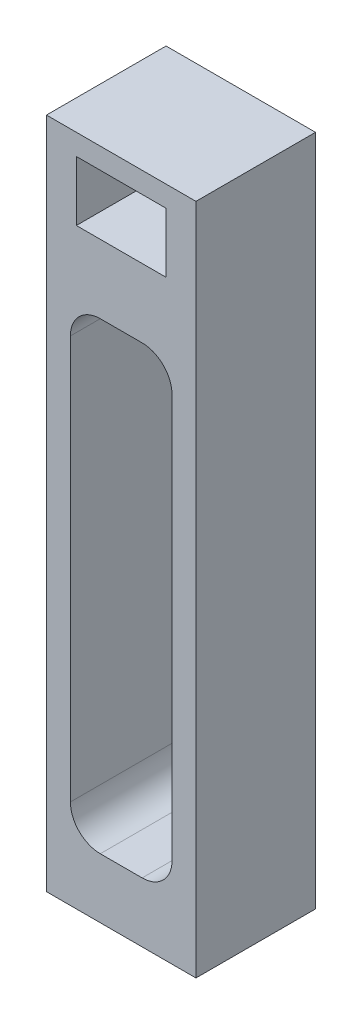
ISO-10303-21;
HEADER;
FILE_DESCRIPTION(('STEP AP214'),'2;1');
FILE_NAME('part.step','',(''),(''),'','','');
FILE_SCHEMA(('AUTOMOTIVE_DESIGN { 1 0 10303 214 1 1 1 1 }'));
ENDSEC;
DATA;
#1=APPLICATION_CONTEXT('core data for automotive mechanical design processes');
#2=APPLICATION_PROTOCOL_DEFINITION('international standard','automotive_design',2000,#1);
#3=PRODUCT_CONTEXT('',#1,'mechanical');
#4=PRODUCT('Part','Part','',(#3));
#5=PRODUCT_RELATED_PRODUCT_CATEGORY('part','',(#4));
#6=PRODUCT_DEFINITION_FORMATION('','',#4);
#7=PRODUCT_DEFINITION_CONTEXT('part definition',#1,'design');
#8=PRODUCT_DEFINITION('design','',#6,#7);
#9=PRODUCT_DEFINITION_SHAPE('','',#8);
#10=(LENGTH_UNIT() NAMED_UNIT(*) SI_UNIT(.MILLI.,.METRE.));
#11=(NAMED_UNIT(*) PLANE_ANGLE_UNIT() SI_UNIT($,.RADIAN.));
#12=(NAMED_UNIT(*) SI_UNIT($,.STERADIAN.) SOLID_ANGLE_UNIT());
#13=UNCERTAINTY_MEASURE_WITH_UNIT(LENGTH_MEASURE(1.E-05),#10,'distance_accuracy_value','');
#14=(GEOMETRIC_REPRESENTATION_CONTEXT(3) GLOBAL_UNCERTAINTY_ASSIGNED_CONTEXT((#13)) GLOBAL_UNIT_ASSIGNED_CONTEXT((#10,
#11,#12)) REPRESENTATION_CONTEXT('',''));
#15=CARTESIAN_POINT('',(0.,0.,0.));
#16=DIRECTION('',(0.,0.,1.));
#17=DIRECTION('',(1.,0.,0.));
#18=AXIS2_PLACEMENT_3D('',#15,#16,#17);
#19=CARTESIAN_POINT('',(12.5,-12.5,10.));
#20=DIRECTION('',(1.,0.,0.));
#21=DIRECTION('',(0.,0.,-1.));
#22=AXIS2_PLACEMENT_3D('',#19,#20,#21);
#23=PLANE('',#22);
#24=DIRECTION('',(0.,1.,0.));
#25=VECTOR('',#24,1.);
#26=CARTESIAN_POINT('',(12.5,-12.5,-10.));
#27=LINE('',#26,#25);
#28=CARTESIAN_POINT('',(12.5,-12.5,-10.));
#29=VERTEX_POINT('',#28);
#30=CARTESIAN_POINT('',(12.5,100.,-10.));
#31=VERTEX_POINT('',#30);
#32=EDGE_CURVE('E36',#29,#31,#27,.T.);
#33=ORIENTED_EDGE('',*,*,#32,.T.);
#34=DIRECTION('',(0.,0.,-1.));
#35=VECTOR('',#34,1.);
#36=CARTESIAN_POINT('',(12.5,100.,10.));
#37=LINE('',#36,#35);
#38=CARTESIAN_POINT('',(12.5,100.,10.));
#39=VERTEX_POINT('',#38);
#40=EDGE_CURVE('E240',#39,#31,#37,.T.);
#41=ORIENTED_EDGE('',*,*,#40,.F.);
#42=DIRECTION('',(0.,1.,0.));
#43=VECTOR('',#42,1.);
#44=CARTESIAN_POINT('',(12.5,-12.5,10.));
#45=LINE('',#44,#43);
#46=CARTESIAN_POINT('',(12.5,-12.5,10.));
#47=VERTEX_POINT('',#46);
#48=EDGE_CURVE('E11',#47,#39,#45,.T.);
#49=ORIENTED_EDGE('',*,*,#48,.F.);
#50=DIRECTION('',(0.,0.,-1.));
#51=VECTOR('',#50,1.);
#52=CARTESIAN_POINT('',(12.5,-12.5,10.));
#53=LINE('',#52,#51);
#54=EDGE_CURVE('E258',#47,#29,#53,.T.);
#55=ORIENTED_EDGE('',*,*,#54,.T.);
#56=EDGE_LOOP('',(#33,#41,#49,#55));
#57=FACE_BOUND('',#56,.T.);
#58=ADVANCED_FACE('F33',(#57),#23,.T.);
#59=CARTESIAN_POINT('',(-12.5,-12.5,10.));
#60=DIRECTION('',(0.,0.,1.));
#61=DIRECTION('',(1.,0.,0.));
#62=AXIS2_PLACEMENT_3D('',#59,#60,#61);
#63=PLANE('',#62);
#64=CARTESIAN_POINT('',(-3.5,2.5,10.));
#65=DIRECTION('',(0.,0.,1.));
#66=DIRECTION('',(1.,0.,0.));
#67=AXIS2_PLACEMENT_3D('',#64,#65,#66);
#68=CIRCLE('',#67,5.);
#69=CARTESIAN_POINT('',(-8.5,2.50000000000004,10.));
#70=VERTEX_POINT('',#69);
#71=CARTESIAN_POINT('',(-3.49999999999996,-2.5,10.));
#72=VERTEX_POINT('',#71);
#73=EDGE_CURVE('E49',#70,#72,#68,.T.);
#74=ORIENTED_EDGE('',*,*,#73,.F.);
#75=DIRECTION('',(0.,-1.,0.));
#76=VECTOR('',#75,1.);
#77=CARTESIAN_POINT('',(-8.5,2.50000000000004,10.));
#78=LINE('',#77,#76);
#79=CARTESIAN_POINT('',(-8.5,70.,10.));
#80=VERTEX_POINT('',#79);
#81=EDGE_CURVE('E165',#80,#70,#78,.T.);
#82=ORIENTED_EDGE('',*,*,#81,.F.);
#83=CARTESIAN_POINT('',(-3.5,70.,10.));
#84=DIRECTION('',(0.,0.,1.));
#85=DIRECTION('',(1.,0.,0.));
#86=AXIS2_PLACEMENT_3D('',#83,#84,#85);
#87=CIRCLE('',#86,5.);
#88=CARTESIAN_POINT('',(-3.49999999999996,75.,10.));
#89=VERTEX_POINT('',#88);
#90=EDGE_CURVE('E168',#89,#80,#87,.T.);
#91=ORIENTED_EDGE('',*,*,#90,.F.);
#92=DIRECTION('',(-1.,0.,0.));
#93=VECTOR('',#92,1.);
#94=CARTESIAN_POINT('',(-3.49999999999996,75.,10.));
#95=LINE('',#94,#93);
#96=CARTESIAN_POINT('',(3.49999999999997,75.,10.));
#97=VERTEX_POINT('',#96);
#98=EDGE_CURVE('E196',#97,#89,#95,.T.);
#99=ORIENTED_EDGE('',*,*,#98,.F.);
#100=CARTESIAN_POINT('',(3.5,70.,10.));
#101=DIRECTION('',(0.,0.,1.));
#102=DIRECTION('',(1.,0.,0.));
#103=AXIS2_PLACEMENT_3D('',#100,#101,#102);
#104=CIRCLE('',#103,5.);
#105=CARTESIAN_POINT('',(8.50000000000001,70.,10.));
#106=VERTEX_POINT('',#105);
#107=EDGE_CURVE('E193',#106,#97,#104,.T.);
#108=ORIENTED_EDGE('',*,*,#107,.F.);
#109=DIRECTION('',(0.,1.,0.));
#110=VECTOR('',#109,1.);
#111=CARTESIAN_POINT('',(8.5,2.50000000000004,10.));
#112=LINE('',#111,#110);
#113=CARTESIAN_POINT('',(8.5,2.50000000000004,10.));
#114=VERTEX_POINT('',#113);
#115=EDGE_CURVE('E190',#114,#106,#112,.T.);
#116=ORIENTED_EDGE('',*,*,#115,.F.);
#117=CARTESIAN_POINT('',(3.5,2.5,10.));
#118=DIRECTION('',(0.,0.,1.));
#119=DIRECTION('',(1.,0.,0.));
#120=AXIS2_PLACEMENT_3D('',#117,#118,#119);
#121=CIRCLE('',#120,5.);
#122=CARTESIAN_POINT('',(3.49999999999997,-2.5,10.));
#123=VERTEX_POINT('',#122);
#124=EDGE_CURVE('E187',#123,#114,#121,.T.);
#125=ORIENTED_EDGE('',*,*,#124,.F.);
#126=DIRECTION('',(1.,0.,0.));
#127=VECTOR('',#126,1.);
#128=CARTESIAN_POINT('',(-3.49999999999996,-2.5,10.));
#129=LINE('',#128,#127);
#130=EDGE_CURVE('E185',#72,#123,#129,.T.);
#131=ORIENTED_EDGE('',*,*,#130,.F.);
#132=EDGE_LOOP('',(#74,#82,#91,#99,#108,#116,#125,#131));
#133=FACE_BOUND('',#132,.T.);
#134=DIRECTION('',(0.,1.,0.));
#135=VECTOR('',#134,1.);
#136=CARTESIAN_POINT('',(7.5,86.5,10.));
#137=LINE('',#136,#135);
#138=CARTESIAN_POINT('',(7.5,86.5,10.));
#139=VERTEX_POINT('',#138);
#140=CARTESIAN_POINT('',(7.5,96.5,10.));
#141=VERTEX_POINT('',#140);
#142=EDGE_CURVE('E203',#139,#141,#137,.T.);
#143=ORIENTED_EDGE('',*,*,#142,.F.);
#144=DIRECTION('',(1.,0.,0.));
#145=VECTOR('',#144,1.);
#146=CARTESIAN_POINT('',(-7.5,86.5,10.));
#147=LINE('',#146,#145);
#148=CARTESIAN_POINT('',(-7.5,86.5,10.));
#149=VERTEX_POINT('',#148);
#150=EDGE_CURVE('E219',#149,#139,#147,.T.);
#151=ORIENTED_EDGE('',*,*,#150,.F.);
#152=DIRECTION('',(0.,-1.,0.));
#153=VECTOR('',#152,1.);
#154=CARTESIAN_POINT('',(-7.5,86.5,10.));
#155=LINE('',#154,#153);
#156=CARTESIAN_POINT('',(-7.5,96.5,10.));
#157=VERTEX_POINT('',#156);
#158=EDGE_CURVE('E233',#157,#149,#155,.T.);
#159=ORIENTED_EDGE('',*,*,#158,.F.);
#160=DIRECTION('',(-1.,0.,0.));
#161=VECTOR('',#160,1.);
#162=CARTESIAN_POINT('',(-7.5,96.5,10.));
#163=LINE('',#162,#161);
#164=EDGE_CURVE('E230',#141,#157,#163,.T.);
#165=ORIENTED_EDGE('',*,*,#164,.F.);
#166=EDGE_LOOP('',(#143,#151,#159,#165));
#167=FACE_BOUND('',#166,.T.);
#168=ORIENTED_EDGE('',*,*,#48,.T.);
#169=DIRECTION('',(1.,0.,0.));
#170=VECTOR('',#169,1.);
#171=CARTESIAN_POINT('',(-12.5,100.,10.));
#172=LINE('',#171,#170);
#173=CARTESIAN_POINT('',(-12.5,100.,10.));
#174=VERTEX_POINT('',#173);
#175=EDGE_CURVE('E255',#174,#39,#172,.T.);
#176=ORIENTED_EDGE('',*,*,#175,.F.);
#177=DIRECTION('',(0.,1.,0.));
#178=VECTOR('',#177,1.);
#179=CARTESIAN_POINT('',(-12.5,-12.5,10.));
#180=LINE('',#179,#178);
#181=CARTESIAN_POINT('',(-12.5,-12.5,10.));
#182=VERTEX_POINT('',#181);
#183=EDGE_CURVE('E41',#182,#174,#180,.T.);
#184=ORIENTED_EDGE('',*,*,#183,.F.);
#185=DIRECTION('',(1.,0.,0.));
#186=VECTOR('',#185,1.);
#187=CARTESIAN_POINT('',(-12.5,-12.5,10.));
#188=LINE('',#187,#186);
#189=EDGE_CURVE('E267',#182,#47,#188,.T.);
#190=ORIENTED_EDGE('',*,*,#189,.T.);
#191=EDGE_LOOP('',(#168,#176,#184,#190));
#192=FACE_BOUND('',#191,.T.);
#193=ADVANCED_FACE('F282',(#133,#167,#192),#63,.T.);
#194=CARTESIAN_POINT('',(-12.5,-12.5,10.));
#195=DIRECTION('',(-1.,0.,0.));
#196=DIRECTION('',(0.,0.,1.));
#197=AXIS2_PLACEMENT_3D('',#194,#195,#196);
#198=PLANE('',#197);
#199=ORIENTED_EDGE('',*,*,#183,.T.);
#200=DIRECTION('',(0.,0.,1.));
#201=VECTOR('',#200,1.);
#202=CARTESIAN_POINT('',(-12.5,100.,10.));
#203=LINE('',#202,#201);
#204=CARTESIAN_POINT('',(-12.5,100.,-10.));
#205=VERTEX_POINT('',#204);
#206=EDGE_CURVE('E252',#205,#174,#203,.T.);
#207=ORIENTED_EDGE('',*,*,#206,.F.);
#208=DIRECTION('',(0.,1.,0.));
#209=VECTOR('',#208,1.);
#210=CARTESIAN_POINT('',(-12.5,-12.5,-10.));
#211=LINE('',#210,#209);
#212=CARTESIAN_POINT('',(-12.5,-12.5,-10.));
#213=VERTEX_POINT('',#212);
#214=EDGE_CURVE('E270',#213,#205,#211,.T.);
#215=ORIENTED_EDGE('',*,*,#214,.F.);
#216=DIRECTION('',(0.,0.,1.));
#217=VECTOR('',#216,1.);
#218=CARTESIAN_POINT('',(-12.5,-12.5,10.));
#219=LINE('',#218,#217);
#220=EDGE_CURVE('E264',#213,#182,#219,.T.);
#221=ORIENTED_EDGE('',*,*,#220,.T.);
#222=EDGE_LOOP('',(#199,#207,#215,#221));
#223=FACE_BOUND('',#222,.T.);
#224=ADVANCED_FACE('F288',(#223),#198,.T.);
#225=CARTESIAN_POINT('',(-12.5,-12.5,-10.));
#226=DIRECTION('',(0.,0.,-1.));
#227=DIRECTION('',(-1.,0.,0.));
#228=AXIS2_PLACEMENT_3D('',#225,#226,#227);
#229=PLANE('',#228);
#230=CARTESIAN_POINT('',(-3.5,2.5,-10.));
#231=DIRECTION('',(0.,0.,1.));
#232=DIRECTION('',(1.,0.,0.));
#233=AXIS2_PLACEMENT_3D('',#230,#231,#232);
#234=CIRCLE('',#233,5.);
#235=CARTESIAN_POINT('',(-8.5,2.50000000000004,-10.));
#236=VERTEX_POINT('',#235);
#237=CARTESIAN_POINT('',(-3.49999999999996,-2.5,-10.));
#238=VERTEX_POINT('',#237);
#239=EDGE_CURVE('E148',#236,#238,#234,.T.);
#240=ORIENTED_EDGE('',*,*,#239,.T.);
#241=DIRECTION('',(1.,0.,0.));
#242=VECTOR('',#241,1.);
#243=CARTESIAN_POINT('',(-3.49999999999996,-2.5,-10.));
#244=LINE('',#243,#242);
#245=CARTESIAN_POINT('',(3.49999999999996,-2.5,-10.));
#246=VERTEX_POINT('',#245);
#247=EDGE_CURVE('E157',#238,#246,#244,.T.);
#248=ORIENTED_EDGE('',*,*,#247,.T.);
#249=CARTESIAN_POINT('',(3.5,2.5,-10.));
#250=DIRECTION('',(0.,0.,1.));
#251=DIRECTION('',(1.,0.,0.));
#252=AXIS2_PLACEMENT_3D('',#249,#250,#251);
#253=CIRCLE('',#252,5.);
#254=CARTESIAN_POINT('',(8.5,2.50000000000004,-10.));
#255=VERTEX_POINT('',#254);
#256=EDGE_CURVE('E57',#246,#255,#253,.T.);
#257=ORIENTED_EDGE('',*,*,#256,.T.);
#258=DIRECTION('',(0.,1.,0.));
#259=VECTOR('',#258,1.);
#260=CARTESIAN_POINT('',(8.5,2.50000000000004,-10.));
#261=LINE('',#260,#259);
#262=CARTESIAN_POINT('',(8.50000000000001,70.,-10.));
#263=VERTEX_POINT('',#262);
#264=EDGE_CURVE('E172',#255,#263,#261,.T.);
#265=ORIENTED_EDGE('',*,*,#264,.T.);
#266=CARTESIAN_POINT('',(3.5,70.,-10.));
#267=DIRECTION('',(0.,0.,1.));
#268=DIRECTION('',(1.,0.,0.));
#269=AXIS2_PLACEMENT_3D('',#266,#267,#268);
#270=CIRCLE('',#269,5.);
#271=CARTESIAN_POINT('',(3.49999999999997,75.,-10.));
#272=VERTEX_POINT('',#271);
#273=EDGE_CURVE('E175',#263,#272,#270,.T.);
#274=ORIENTED_EDGE('',*,*,#273,.T.);
#275=DIRECTION('',(-1.,0.,0.));
#276=VECTOR('',#275,1.);
#277=CARTESIAN_POINT('',(-3.49999999999996,75.,-10.));
#278=LINE('',#277,#276);
#279=CARTESIAN_POINT('',(-3.49999999999996,75.,-10.));
#280=VERTEX_POINT('',#279);
#281=EDGE_CURVE('E178',#272,#280,#278,.T.);
#282=ORIENTED_EDGE('',*,*,#281,.T.);
#283=CARTESIAN_POINT('',(-3.5,70.,-10.));
#284=DIRECTION('',(0.,0.,1.));
#285=DIRECTION('',(1.,0.,0.));
#286=AXIS2_PLACEMENT_3D('',#283,#284,#285);
#287=CIRCLE('',#286,5.);
#288=CARTESIAN_POINT('',(-8.5,70.,-10.));
#289=VERTEX_POINT('',#288);
#290=EDGE_CURVE('E181',#280,#289,#287,.T.);
#291=ORIENTED_EDGE('',*,*,#290,.T.);
#292=DIRECTION('',(0.,-1.,0.));
#293=VECTOR('',#292,1.);
#294=CARTESIAN_POINT('',(-8.5,2.50000000000004,-10.));
#295=LINE('',#294,#293);
#296=EDGE_CURVE('E154',#289,#236,#295,.T.);
#297=ORIENTED_EDGE('',*,*,#296,.T.);
#298=EDGE_LOOP('',(#240,#248,#257,#265,#274,#282,#291,#297));
#299=FACE_BOUND('',#298,.T.);
#300=DIRECTION('',(0.,1.,0.));
#301=VECTOR('',#300,1.);
#302=CARTESIAN_POINT('',(7.5,86.5,-10.));
#303=LINE('',#302,#301);
#304=CARTESIAN_POINT('',(7.5,86.5,-10.));
#305=VERTEX_POINT('',#304);
#306=CARTESIAN_POINT('',(7.5,96.5,-10.));
#307=VERTEX_POINT('',#306);
#308=EDGE_CURVE('E215',#305,#307,#303,.T.);
#309=ORIENTED_EDGE('',*,*,#308,.T.);
#310=DIRECTION('',(-1.,0.,0.));
#311=VECTOR('',#310,1.);
#312=CARTESIAN_POINT('',(-7.5,96.5,-10.));
#313=LINE('',#312,#311);
#314=CARTESIAN_POINT('',(-7.5,96.5,-10.));
#315=VERTEX_POINT('',#314);
#316=EDGE_CURVE('E218',#307,#315,#313,.T.);
#317=ORIENTED_EDGE('',*,*,#316,.T.);
#318=DIRECTION('',(0.,-1.,0.));
#319=VECTOR('',#318,1.);
#320=CARTESIAN_POINT('',(-7.5,86.5,-10.));
#321=LINE('',#320,#319);
#322=CARTESIAN_POINT('',(-7.5,86.5,-10.));
#323=VERTEX_POINT('',#322);
#324=EDGE_CURVE('E222',#315,#323,#321,.T.);
#325=ORIENTED_EDGE('',*,*,#324,.T.);
#326=DIRECTION('',(1.,0.,0.));
#327=VECTOR('',#326,1.);
#328=CARTESIAN_POINT('',(-7.5,86.5,-10.));
#329=LINE('',#328,#327);
#330=EDGE_CURVE('E225',#323,#305,#329,.T.);
#331=ORIENTED_EDGE('',*,*,#330,.T.);
#332=EDGE_LOOP('',(#309,#317,#325,#331));
#333=FACE_BOUND('',#332,.T.);
#334=ORIENTED_EDGE('',*,*,#214,.T.);
#335=DIRECTION('',(-1.,0.,0.));
#336=VECTOR('',#335,1.);
#337=CARTESIAN_POINT('',(-12.5,100.,-10.));
#338=LINE('',#337,#336);
#339=EDGE_CURVE('E249',#31,#205,#338,.T.);
#340=ORIENTED_EDGE('',*,*,#339,.F.);
#341=ORIENTED_EDGE('',*,*,#32,.F.);
#342=DIRECTION('',(-1.,0.,0.));
#343=VECTOR('',#342,1.);
#344=CARTESIAN_POINT('',(-12.5,-12.5,-10.));
#345=LINE('',#344,#343);
#346=EDGE_CURVE('E261',#29,#213,#345,.T.);
#347=ORIENTED_EDGE('',*,*,#346,.T.);
#348=EDGE_LOOP('',(#334,#340,#341,#347));
#349=FACE_BOUND('',#348,.T.);
#350=ADVANCED_FACE('F161',(#299,#333,#349),#229,.T.);
#351=CARTESIAN_POINT('',(0.,-12.5,0.));
#352=DIRECTION('',(0.,-1.,0.));
#353=DIRECTION('',(0.,0.,-1.));
#354=AXIS2_PLACEMENT_3D('',#351,#352,#353);
#355=PLANE('',#354);
#356=ORIENTED_EDGE('',*,*,#54,.F.);
#357=ORIENTED_EDGE('',*,*,#189,.F.);
#358=ORIENTED_EDGE('',*,*,#220,.F.);
#359=ORIENTED_EDGE('',*,*,#346,.F.);
#360=EDGE_LOOP('',(#356,#357,#358,#359));
#361=FACE_BOUND('',#360,.T.);
#362=ADVANCED_FACE('F285',(#361),#355,.T.);
#363=CARTESIAN_POINT('',(0.,100.,0.));
#364=DIRECTION('',(0.,-1.,0.));
#365=DIRECTION('',(0.,0.,-1.));
#366=AXIS2_PLACEMENT_3D('',#363,#364,#365);
#367=PLANE('',#366);
#368=ORIENTED_EDGE('',*,*,#40,.T.);
#369=ORIENTED_EDGE('',*,*,#339,.T.);
#370=ORIENTED_EDGE('',*,*,#206,.T.);
#371=ORIENTED_EDGE('',*,*,#175,.T.);
#372=EDGE_LOOP('',(#368,#369,#370,#371));
#373=FACE_BOUND('',#372,.T.);
#374=ADVANCED_FACE('F279',(#373),#367,.F.);
#375=CARTESIAN_POINT('',(7.5,86.5,-10.));
#376=DIRECTION('',(1.,0.,0.));
#377=DIRECTION('',(0.,1.,0.));
#378=AXIS2_PLACEMENT_3D('',#375,#376,#377);
#379=PLANE('',#378);
#380=ORIENTED_EDGE('',*,*,#142,.T.);
#381=DIRECTION('',(0.,0.,1.));
#382=VECTOR('',#381,1.);
#383=CARTESIAN_POINT('',(7.5,96.5,-10.));
#384=LINE('',#383,#382);
#385=EDGE_CURVE('E228',#307,#141,#384,.T.);
#386=ORIENTED_EDGE('',*,*,#385,.F.);
#387=ORIENTED_EDGE('',*,*,#308,.F.);
#388=DIRECTION('',(0.,0.,1.));
#389=VECTOR('',#388,1.);
#390=CARTESIAN_POINT('',(7.5,86.5,-10.));
#391=LINE('',#390,#389);
#392=EDGE_CURVE('E238',#305,#139,#391,.T.);
#393=ORIENTED_EDGE('',*,*,#392,.T.);
#394=EDGE_LOOP('',(#380,#386,#387,#393));
#395=FACE_BOUND('',#394,.T.);
#396=ADVANCED_FACE('F400',(#395),#379,.F.);
#397=CARTESIAN_POINT('',(-7.5,86.5,-10.));
#398=DIRECTION('',(0.,-1.,0.));
#399=DIRECTION('',(0.,0.,-1.));
#400=AXIS2_PLACEMENT_3D('',#397,#398,#399);
#401=PLANE('',#400);
#402=ORIENTED_EDGE('',*,*,#150,.T.);
#403=ORIENTED_EDGE('',*,*,#392,.F.);
#404=ORIENTED_EDGE('',*,*,#330,.F.);
#405=DIRECTION('',(0.,0.,1.));
#406=VECTOR('',#405,1.);
#407=CARTESIAN_POINT('',(-7.5,86.5,-10.));
#408=LINE('',#407,#406);
#409=EDGE_CURVE('E241',#323,#149,#408,.T.);
#410=ORIENTED_EDGE('',*,*,#409,.T.);
#411=EDGE_LOOP('',(#402,#403,#404,#410));
#412=FACE_BOUND('',#411,.T.);
#413=ADVANCED_FACE('F396',(#412),#401,.F.);
#414=CARTESIAN_POINT('',(-7.5,86.5,-10.));
#415=DIRECTION('',(-1.,0.,0.));
#416=DIRECTION('',(0.,0.,1.));
#417=AXIS2_PLACEMENT_3D('',#414,#415,#416);
#418=PLANE('',#417);
#419=ORIENTED_EDGE('',*,*,#158,.T.);
#420=ORIENTED_EDGE('',*,*,#409,.F.);
#421=ORIENTED_EDGE('',*,*,#324,.F.);
#422=DIRECTION('',(0.,0.,1.));
#423=VECTOR('',#422,1.);
#424=CARTESIAN_POINT('',(-7.5,96.5,-10.));
#425=LINE('',#424,#423);
#426=EDGE_CURVE('E243',#315,#157,#425,.T.);
#427=ORIENTED_EDGE('',*,*,#426,.T.);
#428=EDGE_LOOP('',(#419,#420,#421,#427));
#429=FACE_BOUND('',#428,.T.);
#430=ADVANCED_FACE('F399',(#429),#418,.F.);
#431=CARTESIAN_POINT('',(-7.5,96.5,-10.));
#432=DIRECTION('',(0.,1.,0.));
#433=DIRECTION('',(0.,0.,1.));
#434=AXIS2_PLACEMENT_3D('',#431,#432,#433);
#435=PLANE('',#434);
#436=ORIENTED_EDGE('',*,*,#164,.T.);
#437=ORIENTED_EDGE('',*,*,#426,.F.);
#438=ORIENTED_EDGE('',*,*,#316,.F.);
#439=ORIENTED_EDGE('',*,*,#385,.T.);
#440=EDGE_LOOP('',(#436,#437,#438,#439));
#441=FACE_BOUND('',#440,.T.);
#442=ADVANCED_FACE('F311',(#441),#435,.F.);
#443=CARTESIAN_POINT('',(-3.5,2.5,-10.));
#444=DIRECTION('',(0.,0.,1.));
#445=DIRECTION('',(1.,0.,0.));
#446=AXIS2_PLACEMENT_3D('',#443,#444,#445);
#447=CYLINDRICAL_SURFACE('',#446,5.);
#448=ORIENTED_EDGE('',*,*,#73,.T.);
#449=DIRECTION('',(0.,0.,1.));
#450=VECTOR('',#449,1.);
#451=CARTESIAN_POINT('',(-3.49999999999996,-2.5,-10.));
#452=LINE('',#451,#450);
#453=EDGE_CURVE('E144',#238,#72,#452,.T.);
#454=ORIENTED_EDGE('',*,*,#453,.F.);
#455=ORIENTED_EDGE('',*,*,#239,.F.);
#456=DIRECTION('',(0.,0.,1.));
#457=VECTOR('',#456,1.);
#458=CARTESIAN_POINT('',(-8.5,2.50000000000004,-10.));
#459=LINE('',#458,#457);
#460=EDGE_CURVE('E201',#236,#70,#459,.T.);
#461=ORIENTED_EDGE('',*,*,#460,.T.);
#462=EDGE_LOOP('',(#448,#454,#455,#461));
#463=FACE_BOUND('',#462,.T.);
#464=ADVANCED_FACE('F146',(#463),#447,.F.);
#465=CARTESIAN_POINT('',(-8.5,2.50000000000004,-10.));
#466=DIRECTION('',(-1.,0.,0.));
#467=DIRECTION('',(0.,0.,1.));
#468=AXIS2_PLACEMENT_3D('',#465,#466,#467);
#469=PLANE('',#468);
#470=ORIENTED_EDGE('',*,*,#81,.T.);
#471=ORIENTED_EDGE('',*,*,#460,.F.);
#472=ORIENTED_EDGE('',*,*,#296,.F.);
#473=DIRECTION('',(0.,0.,1.));
#474=VECTOR('',#473,1.);
#475=CARTESIAN_POINT('',(-8.5,70.,-10.));
#476=LINE('',#475,#474);
#477=EDGE_CURVE('E204',#289,#80,#476,.T.);
#478=ORIENTED_EDGE('',*,*,#477,.T.);
#479=EDGE_LOOP('',(#470,#471,#472,#478));
#480=FACE_BOUND('',#479,.T.);
#481=ADVANCED_FACE('F325',(#480),#469,.F.);
#482=CARTESIAN_POINT('',(-3.5,70.,-10.));
#483=DIRECTION('',(0.,0.,1.));
#484=DIRECTION('',(1.,0.,0.));
#485=AXIS2_PLACEMENT_3D('',#482,#483,#484);
#486=CYLINDRICAL_SURFACE('',#485,5.);
#487=ORIENTED_EDGE('',*,*,#90,.T.);
#488=ORIENTED_EDGE('',*,*,#477,.F.);
#489=ORIENTED_EDGE('',*,*,#290,.F.);
#490=DIRECTION('',(0.,0.,1.));
#491=VECTOR('',#490,1.);
#492=CARTESIAN_POINT('',(-3.49999999999996,75.,-10.));
#493=LINE('',#492,#491);
#494=EDGE_CURVE('E206',#280,#89,#493,.T.);
#495=ORIENTED_EDGE('',*,*,#494,.T.);
#496=EDGE_LOOP('',(#487,#488,#489,#495));
#497=FACE_BOUND('',#496,.T.);
#498=ADVANCED_FACE('F334',(#497),#486,.F.);
#499=CARTESIAN_POINT('',(-3.49999999999996,75.,-10.));
#500=DIRECTION('',(0.,1.,0.));
#501=DIRECTION('',(0.,0.,1.));
#502=AXIS2_PLACEMENT_3D('',#499,#500,#501);
#503=PLANE('',#502);
#504=ORIENTED_EDGE('',*,*,#98,.T.);
#505=ORIENTED_EDGE('',*,*,#494,.F.);
#506=ORIENTED_EDGE('',*,*,#281,.F.);
#507=DIRECTION('',(0.,0.,1.));
#508=VECTOR('',#507,1.);
#509=CARTESIAN_POINT('',(3.49999999999997,75.,-10.));
#510=LINE('',#509,#508);
#511=EDGE_CURVE('E208',#272,#97,#510,.T.);
#512=ORIENTED_EDGE('',*,*,#511,.T.);
#513=EDGE_LOOP('',(#504,#505,#506,#512));
#514=FACE_BOUND('',#513,.T.);
#515=ADVANCED_FACE('F344',(#514),#503,.F.);
#516=CARTESIAN_POINT('',(3.5,70.,-10.));
#517=DIRECTION('',(0.,0.,1.));
#518=DIRECTION('',(1.,0.,0.));
#519=AXIS2_PLACEMENT_3D('',#516,#517,#518);
#520=CYLINDRICAL_SURFACE('',#519,5.);
#521=ORIENTED_EDGE('',*,*,#107,.T.);
#522=ORIENTED_EDGE('',*,*,#511,.F.);
#523=ORIENTED_EDGE('',*,*,#273,.F.);
#524=DIRECTION('',(0.,0.,1.));
#525=VECTOR('',#524,1.);
#526=CARTESIAN_POINT('',(8.50000000000001,70.,-10.));
#527=LINE('',#526,#525);
#528=EDGE_CURVE('E210',#263,#106,#527,.T.);
#529=ORIENTED_EDGE('',*,*,#528,.T.);
#530=EDGE_LOOP('',(#521,#522,#523,#529));
#531=FACE_BOUND('',#530,.T.);
#532=ADVANCED_FACE('F354',(#531),#520,.F.);
#533=CARTESIAN_POINT('',(8.5,2.50000000000004,-10.));
#534=DIRECTION('',(1.,0.,0.));
#535=DIRECTION('',(0.,0.,-1.));
#536=AXIS2_PLACEMENT_3D('',#533,#534,#535);
#537=PLANE('',#536);
#538=ORIENTED_EDGE('',*,*,#115,.T.);
#539=ORIENTED_EDGE('',*,*,#528,.F.);
#540=ORIENTED_EDGE('',*,*,#264,.F.);
#541=DIRECTION('',(0.,0.,1.));
#542=VECTOR('',#541,1.);
#543=CARTESIAN_POINT('',(8.5,2.50000000000004,-10.));
#544=LINE('',#543,#542);
#545=EDGE_CURVE('E212',#255,#114,#544,.T.);
#546=ORIENTED_EDGE('',*,*,#545,.T.);
#547=EDGE_LOOP('',(#538,#539,#540,#546));
#548=FACE_BOUND('',#547,.T.);
#549=ADVANCED_FACE('F364',(#548),#537,.F.);
#550=CARTESIAN_POINT('',(3.5,2.5,-10.));
#551=DIRECTION('',(0.,0.,1.));
#552=DIRECTION('',(1.,0.,0.));
#553=AXIS2_PLACEMENT_3D('',#550,#551,#552);
#554=CYLINDRICAL_SURFACE('',#553,5.);
#555=ORIENTED_EDGE('',*,*,#124,.T.);
#556=ORIENTED_EDGE('',*,*,#545,.F.);
#557=ORIENTED_EDGE('',*,*,#256,.F.);
#558=DIRECTION('',(0.,0.,1.));
#559=VECTOR('',#558,1.);
#560=CARTESIAN_POINT('',(3.49999999999997,-2.5,-10.));
#561=LINE('',#560,#559);
#562=EDGE_CURVE('E153',#246,#123,#561,.T.);
#563=ORIENTED_EDGE('',*,*,#562,.T.);
#564=EDGE_LOOP('',(#555,#556,#557,#563));
#565=FACE_BOUND('',#564,.T.);
#566=ADVANCED_FACE('F374',(#565),#554,.F.);
#567=CARTESIAN_POINT('',(-3.49999999999996,-2.5,-10.));
#568=DIRECTION('',(0.,-1.,0.));
#569=DIRECTION('',(0.,0.,-1.));
#570=AXIS2_PLACEMENT_3D('',#567,#568,#569);
#571=PLANE('',#570);
#572=ORIENTED_EDGE('',*,*,#130,.T.);
#573=ORIENTED_EDGE('',*,*,#562,.F.);
#574=ORIENTED_EDGE('',*,*,#247,.F.);
#575=ORIENTED_EDGE('',*,*,#453,.T.);
#576=EDGE_LOOP('',(#572,#573,#574,#575));
#577=FACE_BOUND('',#576,.T.);
#578=ADVANCED_FACE('F158',(#577),#571,.F.);
#579=CLOSED_SHELL('',(#58,#193,#224,#350,#362,#374,#396,#413,#430,#442,#464,#481,#498,#515,#532,
#549,#566,#578));
#580=MANIFOLD_SOLID_BREP('B2',#579);
#581=ADVANCED_BREP_SHAPE_REPRESENTATION('',(#18,#580),#14);
#582=SHAPE_DEFINITION_REPRESENTATION(#9,#581);
ENDSEC;
END-ISO-10303-21;
